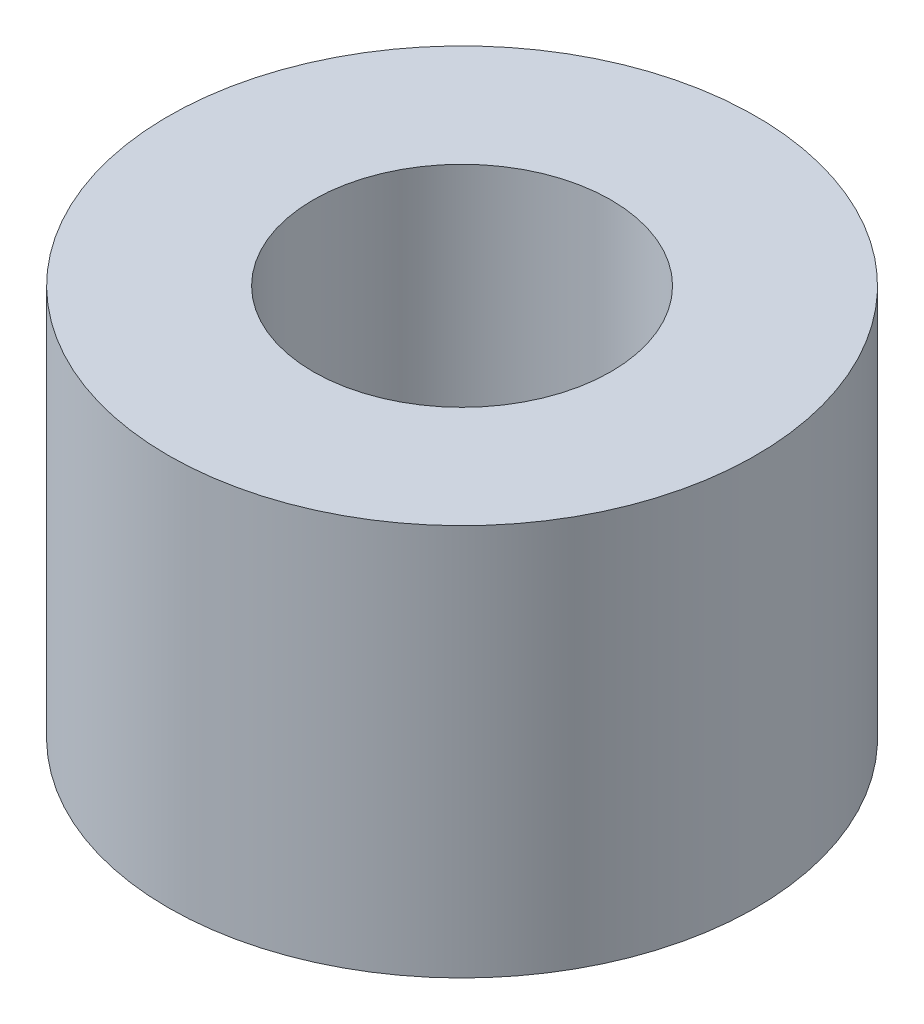
ISO-10303-21;
HEADER;
FILE_DESCRIPTION(('STEP AP214'),'2;1');
FILE_NAME('part.step','',(''),(''),'','','');
FILE_SCHEMA(('AUTOMOTIVE_DESIGN { 1 0 10303 214 1 1 1 1 }'));
ENDSEC;
DATA;
#1=APPLICATION_CONTEXT('core data for automotive mechanical design processes');
#2=APPLICATION_PROTOCOL_DEFINITION('international standard','automotive_design',2000,#1);
#3=PRODUCT_CONTEXT('',#1,'mechanical');
#4=PRODUCT('Part','Part','',(#3));
#5=PRODUCT_RELATED_PRODUCT_CATEGORY('part','',(#4));
#6=PRODUCT_DEFINITION_FORMATION('','',#4);
#7=PRODUCT_DEFINITION_CONTEXT('part definition',#1,'design');
#8=PRODUCT_DEFINITION('design','',#6,#7);
#9=PRODUCT_DEFINITION_SHAPE('','',#8);
#10=(LENGTH_UNIT() NAMED_UNIT(*) SI_UNIT(.MILLI.,.METRE.));
#11=(NAMED_UNIT(*) PLANE_ANGLE_UNIT() SI_UNIT($,.RADIAN.));
#12=(NAMED_UNIT(*) SI_UNIT($,.STERADIAN.) SOLID_ANGLE_UNIT());
#13=UNCERTAINTY_MEASURE_WITH_UNIT(LENGTH_MEASURE(1.E-05),#10,'distance_accuracy_value','');
#14=(GEOMETRIC_REPRESENTATION_CONTEXT(3) GLOBAL_UNCERTAINTY_ASSIGNED_CONTEXT((#13)) GLOBAL_UNIT_ASSIGNED_CONTEXT((#10,
#11,#12)) REPRESENTATION_CONTEXT('',''));
#15=CARTESIAN_POINT('',(0.,0.,0.));
#16=DIRECTION('',(0.,0.,1.));
#17=DIRECTION('',(1.,0.,0.));
#18=AXIS2_PLACEMENT_3D('',#15,#16,#17);
#19=CARTESIAN_POINT('',(0.,6.35,0.));
#20=DIRECTION('',(0.,1.,0.));
#21=DIRECTION('',(0.,0.,1.));
#22=AXIS2_PLACEMENT_3D('',#19,#20,#21);
#23=PLANE('',#22);
#24=CARTESIAN_POINT('',(0.,6.35,0.));
#25=DIRECTION('',(0.,1.,0.));
#26=DIRECTION('',(0.,0.,1.));
#27=AXIS2_PLACEMENT_3D('',#24,#25,#26);
#28=CIRCLE('',#27,4.7625);
#29=CARTESIAN_POINT('',(0.,6.35,4.7625));
#30=VERTEX_POINT('',#29);
#31=EDGE_CURVE('E10',#30,#30,#28,.T.);
#32=ORIENTED_EDGE('',*,*,#31,.T.);
#33=EDGE_LOOP('',(#32));
#34=FACE_BOUND('',#33,.T.);
#35=CARTESIAN_POINT('',(0.,6.35,0.));
#36=DIRECTION('',(0.,1.,0.));
#37=DIRECTION('',(0.,0.,1.));
#38=AXIS2_PLACEMENT_3D('',#35,#36,#37);
#39=CIRCLE('',#38,2.413);
#40=CARTESIAN_POINT('',(0.,6.35,2.413));
#41=VERTEX_POINT('',#40);
#42=EDGE_CURVE('E48',#41,#41,#39,.T.);
#43=ORIENTED_EDGE('',*,*,#42,.F.);
#44=EDGE_LOOP('',(#43));
#45=FACE_BOUND('',#44,.T.);
#46=ADVANCED_FACE('F37',(#34,#45),#23,.T.);
#47=CARTESIAN_POINT('',(0.,0.,0.));
#48=DIRECTION('',(0.,1.,0.));
#49=DIRECTION('',(0.,0.,1.));
#50=AXIS2_PLACEMENT_3D('',#47,#48,#49);
#51=PLANE('',#50);
#52=CARTESIAN_POINT('',(0.,0.,0.));
#53=DIRECTION('',(0.,1.,0.));
#54=DIRECTION('',(0.,0.,1.));
#55=AXIS2_PLACEMENT_3D('',#52,#53,#54);
#56=CIRCLE('',#55,4.7625);
#57=CARTESIAN_POINT('',(0.,0.,4.7625));
#58=VERTEX_POINT('',#57);
#59=EDGE_CURVE('E41',#58,#58,#56,.T.);
#60=ORIENTED_EDGE('',*,*,#59,.F.);
#61=EDGE_LOOP('',(#60));
#62=FACE_BOUND('',#61,.T.);
#63=CARTESIAN_POINT('',(0.,0.,0.));
#64=DIRECTION('',(0.,1.,0.));
#65=DIRECTION('',(0.,0.,1.));
#66=AXIS2_PLACEMENT_3D('',#63,#64,#65);
#67=CIRCLE('',#66,2.413);
#68=CARTESIAN_POINT('',(0.,0.,2.413));
#69=VERTEX_POINT('',#68);
#70=EDGE_CURVE('E50',#69,#69,#67,.T.);
#71=ORIENTED_EDGE('',*,*,#70,.T.);
#72=EDGE_LOOP('',(#71));
#73=FACE_BOUND('',#72,.T.);
#74=ADVANCED_FACE('F60',(#62,#73),#51,.F.);
#75=CARTESIAN_POINT('',(0.,6.35,0.));
#76=DIRECTION('',(0.,-1.,0.));
#77=DIRECTION('',(0.,0.,-1.));
#78=AXIS2_PLACEMENT_3D('',#75,#76,#77);
#79=CYLINDRICAL_SURFACE('',#78,4.7625);
#80=ORIENTED_EDGE('',*,*,#31,.F.);
#81=EDGE_LOOP('',(#80));
#82=FACE_BOUND('',#81,.T.);
#83=ORIENTED_EDGE('',*,*,#59,.T.);
#84=EDGE_LOOP('',(#83));
#85=FACE_BOUND('',#84,.T.);
#86=ADVANCED_FACE('F39',(#82,#85),#79,.T.);
#87=CARTESIAN_POINT('',(0.,6.35,0.));
#88=DIRECTION('',(0.,-1.,0.));
#89=DIRECTION('',(0.,0.,-1.));
#90=AXIS2_PLACEMENT_3D('',#87,#88,#89);
#91=CYLINDRICAL_SURFACE('',#90,2.413);
#92=ORIENTED_EDGE('',*,*,#42,.T.);
#93=EDGE_LOOP('',(#92));
#94=FACE_BOUND('',#93,.T.);
#95=ORIENTED_EDGE('',*,*,#70,.F.);
#96=EDGE_LOOP('',(#95));
#97=FACE_BOUND('',#96,.T.);
#98=ADVANCED_FACE('F56',(#94,#97),#91,.F.);
#99=CLOSED_SHELL('',(#46,#74,#86,#98));
#100=MANIFOLD_SOLID_BREP('B2',#99);
#101=ADVANCED_BREP_SHAPE_REPRESENTATION('',(#18,#100),#14);
#102=SHAPE_DEFINITION_REPRESENTATION(#9,#101);
ENDSEC;
END-ISO-10303-21;
